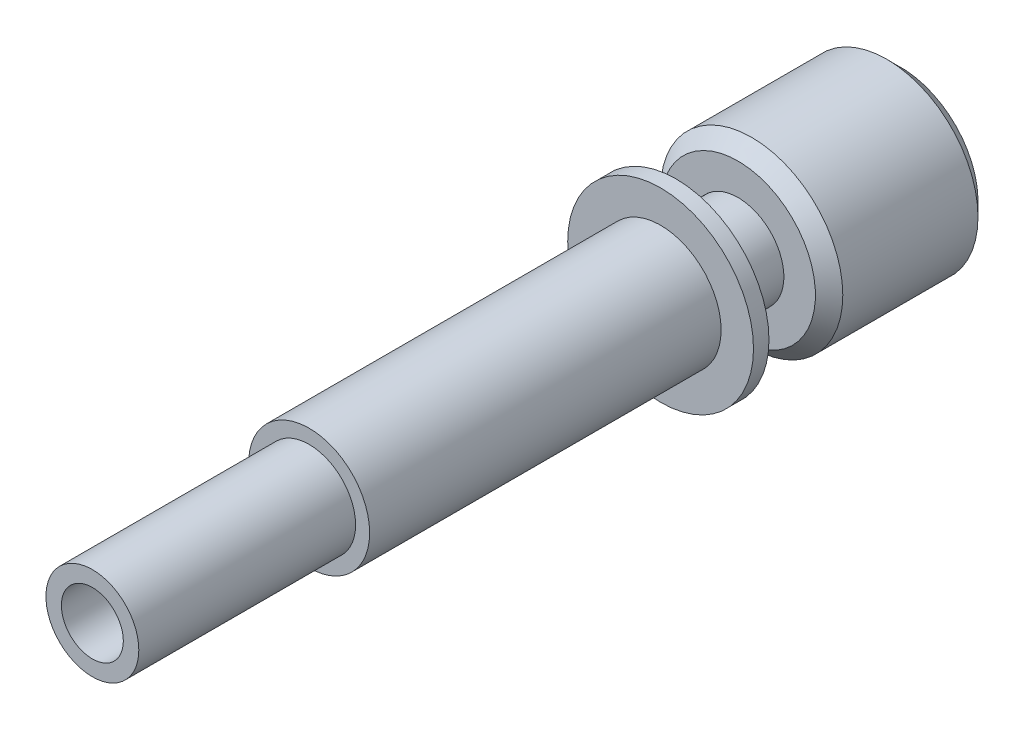
ISO-10303-21;
HEADER;
FILE_DESCRIPTION(('STEP AP214'),'2;1');
FILE_NAME('part.step','',(''),(''),'','','');
FILE_SCHEMA(('AUTOMOTIVE_DESIGN { 1 0 10303 214 1 1 1 1 }'));
ENDSEC;
DATA;
#1=APPLICATION_CONTEXT('core data for automotive mechanical design processes');
#2=APPLICATION_PROTOCOL_DEFINITION('international standard','automotive_design',2000,#1);
#3=PRODUCT_CONTEXT('',#1,'mechanical');
#4=PRODUCT('Part','Part','',(#3));
#5=PRODUCT_RELATED_PRODUCT_CATEGORY('part','',(#4));
#6=PRODUCT_DEFINITION_FORMATION('','',#4);
#7=PRODUCT_DEFINITION_CONTEXT('part definition',#1,'design');
#8=PRODUCT_DEFINITION('design','',#6,#7);
#9=PRODUCT_DEFINITION_SHAPE('','',#8);
#10=(LENGTH_UNIT() NAMED_UNIT(*) SI_UNIT(.MILLI.,.METRE.));
#11=(NAMED_UNIT(*) PLANE_ANGLE_UNIT() SI_UNIT($,.RADIAN.));
#12=(NAMED_UNIT(*) SI_UNIT($,.STERADIAN.) SOLID_ANGLE_UNIT());
#13=UNCERTAINTY_MEASURE_WITH_UNIT(LENGTH_MEASURE(1.E-05),#10,'distance_accuracy_value','');
#14=(GEOMETRIC_REPRESENTATION_CONTEXT(3) GLOBAL_UNCERTAINTY_ASSIGNED_CONTEXT((#13)) GLOBAL_UNIT_ASSIGNED_CONTEXT((#10,
#11,#12)) REPRESENTATION_CONTEXT('',''));
#15=CARTESIAN_POINT('',(0.,0.,0.));
#16=DIRECTION('',(0.,0.,1.));
#17=DIRECTION('',(1.,0.,0.));
#18=AXIS2_PLACEMENT_3D('',#15,#16,#17);
#19=CARTESIAN_POINT('',(0.,0.,0.));
#20=DIRECTION('',(0.,0.,1.));
#21=DIRECTION('',(1.,0.,0.));
#22=AXIS2_PLACEMENT_3D('',#19,#20,#21);
#23=PLANE('',#22);
#24=CARTESIAN_POINT('',(0.,0.,0.));
#25=DIRECTION('',(0.,0.,-1.));
#26=DIRECTION('',(-1.,0.,0.));
#27=AXIS2_PLACEMENT_3D('',#24,#25,#26);
#28=CIRCLE('',#27,1.48);
#29=CARTESIAN_POINT('',(-1.48,0.,0.));
#30=VERTEX_POINT('',#29);
#31=EDGE_CURVE('E18',#30,#30,#28,.T.);
#32=ORIENTED_EDGE('',*,*,#31,.F.);
#33=EDGE_LOOP('',(#32));
#34=FACE_BOUND('',#33,.T.);
#35=CARTESIAN_POINT('',(0.,0.,0.));
#36=DIRECTION('',(0.,0.,1.));
#37=DIRECTION('',(1.,0.,0.));
#38=AXIS2_PLACEMENT_3D('',#35,#36,#37);
#39=CIRCLE('',#38,3.);
#40=CARTESIAN_POINT('',(3.,0.,0.));
#41=VERTEX_POINT('',#40);
#42=EDGE_CURVE('E56',#41,#41,#39,.T.);
#43=ORIENTED_EDGE('',*,*,#42,.F.);
#44=EDGE_LOOP('',(#43));
#45=FACE_BOUND('',#44,.T.);
#46=ADVANCED_FACE('F15',(#34,#45),#23,.F.);
#47=CARTESIAN_POINT('',(0.,0.,0.));
#48=DIRECTION('',(0.,0.,-1.));
#49=DIRECTION('',(-1.,0.,0.));
#50=AXIS2_PLACEMENT_3D('',#47,#48,#49);
#51=CYLINDRICAL_SURFACE('',#50,1.48);
#52=ORIENTED_EDGE('',*,*,#31,.T.);
#53=EDGE_LOOP('',(#52));
#54=FACE_BOUND('',#53,.T.);
#55=CARTESIAN_POINT('',(0.,0.,-2.));
#56=DIRECTION('',(0.,0.,-1.));
#57=DIRECTION('',(-1.,0.,0.));
#58=AXIS2_PLACEMENT_3D('',#55,#56,#57);
#59=CIRCLE('',#58,1.48);
#60=CARTESIAN_POINT('',(-1.48,0.,-2.));
#61=VERTEX_POINT('',#60);
#62=EDGE_CURVE('E54',#61,#61,#59,.F.);
#63=ORIENTED_EDGE('',*,*,#62,.T.);
#64=EDGE_LOOP('',(#63));
#65=FACE_BOUND('',#64,.T.);
#66=ADVANCED_FACE('F63',(#54,#65),#51,.T.);
#67=CARTESIAN_POINT('',(0.,0.,0.));
#68=DIRECTION('',(0.,0.,1.));
#69=DIRECTION('',(1.,0.,0.));
#70=AXIS2_PLACEMENT_3D('',#67,#68,#69);
#71=CYLINDRICAL_SURFACE('',#70,3.);
#72=ORIENTED_EDGE('',*,*,#42,.T.);
#73=EDGE_LOOP('',(#72));
#74=FACE_BOUND('',#73,.T.);
#75=CARTESIAN_POINT('',(0.,0.,0.5));
#76=DIRECTION('',(0.,0.,1.));
#77=DIRECTION('',(1.,0.,0.));
#78=AXIS2_PLACEMENT_3D('',#75,#76,#77);
#79=CIRCLE('',#78,3.);
#80=CARTESIAN_POINT('',(3.,0.,0.5));
#81=VERTEX_POINT('',#80);
#82=EDGE_CURVE('E51',#81,#81,#79,.T.);
#83=ORIENTED_EDGE('',*,*,#82,.F.);
#84=EDGE_LOOP('',(#83));
#85=FACE_BOUND('',#84,.T.);
#86=ADVANCED_FACE('F72',(#74,#85),#71,.T.);
#87=CARTESIAN_POINT('',(0.,0.,-2.));
#88=DIRECTION('',(0.,0.,-1.));
#89=DIRECTION('',(-1.,0.,0.));
#90=AXIS2_PLACEMENT_3D('',#87,#88,#89);
#91=PLANE('',#90);
#92=ORIENTED_EDGE('',*,*,#62,.F.);
#93=EDGE_LOOP('',(#92));
#94=FACE_BOUND('',#93,.T.);
#95=CARTESIAN_POINT('',(0.,0.,-1.99999999995271));
#96=DIRECTION('',(0.,0.,-1.));
#97=DIRECTION('',(-1.,0.,0.));
#98=AXIS2_PLACEMENT_3D('',#95,#96,#97);
#99=CIRCLE('',#98,2.49999999994088);
#100=CARTESIAN_POINT('',(-2.49999999994088,0.,-1.99999999995271));
#101=VERTEX_POINT('',#100);
#102=EDGE_CURVE('E48',#101,#101,#99,.T.);
#103=ORIENTED_EDGE('',*,*,#102,.F.);
#104=EDGE_LOOP('',(#103));
#105=FACE_BOUND('',#104,.T.);
#106=ADVANCED_FACE('F116',(#94,#105),#91,.F.);
#107=CARTESIAN_POINT('',(0.,0.,0.5));
#108=DIRECTION('',(0.,0.,1.));
#109=DIRECTION('',(1.,0.,0.));
#110=AXIS2_PLACEMENT_3D('',#107,#108,#109);
#111=PLANE('',#110);
#112=CARTESIAN_POINT('',(0.,0.,0.5));
#113=DIRECTION('',(0.,0.,1.));
#114=DIRECTION('',(1.,0.,0.));
#115=AXIS2_PLACEMENT_3D('',#112,#113,#114);
#116=CIRCLE('',#115,1.954);
#117=CARTESIAN_POINT('',(1.954,0.,0.5));
#118=VERTEX_POINT('',#117);
#119=EDGE_CURVE('E45',#118,#118,#116,.T.);
#120=ORIENTED_EDGE('',*,*,#119,.F.);
#121=EDGE_LOOP('',(#120));
#122=FACE_BOUND('',#121,.T.);
#123=ORIENTED_EDGE('',*,*,#82,.T.);
#124=EDGE_LOOP('',(#123));
#125=FACE_BOUND('',#124,.T.);
#126=ADVANCED_FACE('F112',(#122,#125),#111,.T.);
#127=CARTESIAN_POINT('',(0.,0.,-2.44199999997363));
#128=DIRECTION('',(0.,0.,-1.));
#129=DIRECTION('',(-1.,0.,0.));
#130=AXIS2_PLACEMENT_3D('',#127,#128,#129);
#131=CONICAL_SURFACE('',#130,2.94199999996181,0.785398163397448);
#132=CARTESIAN_POINT('',(0.,0.,-2.442));
#133=DIRECTION('',(0.,0.,-1.));
#134=DIRECTION('',(-1.,0.,0.));
#135=AXIS2_PLACEMENT_3D('',#132,#133,#134);
#136=CIRCLE('',#135,2.942);
#137=CARTESIAN_POINT('',(-2.942,0.,-2.442));
#138=VERTEX_POINT('',#137);
#139=EDGE_CURVE('E44',#138,#138,#136,.T.);
#140=ORIENTED_EDGE('',*,*,#139,.F.);
#141=EDGE_LOOP('',(#140));
#142=FACE_BOUND('',#141,.T.);
#143=ORIENTED_EDGE('',*,*,#102,.T.);
#144=EDGE_LOOP('',(#143));
#145=FACE_BOUND('',#144,.T.);
#146=ADVANCED_FACE('F108',(#142,#145),#131,.T.);
#147=CARTESIAN_POINT('',(0.,0.,0.5));
#148=DIRECTION('',(0.,0.,1.));
#149=DIRECTION('',(1.,0.,0.));
#150=AXIS2_PLACEMENT_3D('',#147,#148,#149);
#151=CYLINDRICAL_SURFACE('',#150,1.954);
#152=ORIENTED_EDGE('',*,*,#119,.T.);
#153=EDGE_LOOP('',(#152));
#154=FACE_BOUND('',#153,.T.);
#155=CARTESIAN_POINT('',(0.,0.,11.85));
#156=DIRECTION('',(0.,0.,1.));
#157=DIRECTION('',(1.,0.,0.));
#158=AXIS2_PLACEMENT_3D('',#155,#156,#157);
#159=CIRCLE('',#158,1.954);
#160=CARTESIAN_POINT('',(1.954,0.,11.85));
#161=VERTEX_POINT('',#160);
#162=EDGE_CURVE('E41',#161,#161,#159,.T.);
#163=ORIENTED_EDGE('',*,*,#162,.F.);
#164=EDGE_LOOP('',(#163));
#165=FACE_BOUND('',#164,.T.);
#166=ADVANCED_FACE('F104',(#154,#165),#151,.T.);
#167=CARTESIAN_POINT('',(0.,0.,-2.));
#168=DIRECTION('',(0.,0.,-1.));
#169=DIRECTION('',(-1.,0.,0.));
#170=AXIS2_PLACEMENT_3D('',#167,#168,#169);
#171=CYLINDRICAL_SURFACE('',#170,2.942);
#172=ORIENTED_EDGE('',*,*,#139,.T.);
#173=EDGE_LOOP('',(#172));
#174=FACE_BOUND('',#173,.T.);
#175=CARTESIAN_POINT('',(0.,0.,-6.80800000003501));
#176=DIRECTION('',(0.,0.,1.));
#177=DIRECTION('',(1.,0.,0.));
#178=AXIS2_PLACEMENT_3D('',#175,#176,#177);
#179=CIRCLE('',#178,2.94199999996181);
#180=CARTESIAN_POINT('',(2.94199999996181,0.,-6.80800000003501));
#181=VERTEX_POINT('',#180);
#182=EDGE_CURVE('E30',#181,#181,#179,.F.);
#183=ORIENTED_EDGE('',*,*,#182,.F.);
#184=EDGE_LOOP('',(#183));
#185=FACE_BOUND('',#184,.T.);
#186=ADVANCED_FACE('F100',(#174,#185),#171,.T.);
#187=CARTESIAN_POINT('',(0.,0.,11.85));
#188=DIRECTION('',(0.,0.,1.));
#189=DIRECTION('',(1.,0.,0.));
#190=AXIS2_PLACEMENT_3D('',#187,#188,#189);
#191=PLANE('',#190);
#192=CARTESIAN_POINT('',(0.,0.,11.85));
#193=DIRECTION('',(0.,0.,1.));
#194=DIRECTION('',(1.,0.,0.));
#195=AXIS2_PLACEMENT_3D('',#192,#193,#194);
#196=CIRCLE('',#195,1.5);
#197=CARTESIAN_POINT('',(1.5,0.,11.85));
#198=VERTEX_POINT('',#197);
#199=EDGE_CURVE('E38',#198,#198,#196,.T.);
#200=ORIENTED_EDGE('',*,*,#199,.F.);
#201=EDGE_LOOP('',(#200));
#202=FACE_BOUND('',#201,.T.);
#203=ORIENTED_EDGE('',*,*,#162,.T.);
#204=EDGE_LOOP('',(#203));
#205=FACE_BOUND('',#204,.T.);
#206=ADVANCED_FACE('F96',(#202,#205),#191,.T.);
#207=CARTESIAN_POINT('',(0.,0.,-6.80800000009185));
#208=DIRECTION('',(0.,0.,1.));
#209=DIRECTION('',(0.,-1.,0.));
#210=AXIS2_PLACEMENT_3D('',#207,#208,#209);
#211=CONICAL_SURFACE('',#210,2.94199999990497,0.785398163461751);
#212=ORIENTED_EDGE('',*,*,#182,.T.);
#213=EDGE_LOOP('',(#212));
#214=FACE_BOUND('',#213,.T.);
#215=CARTESIAN_POINT('',(0.,0.,-7.24999999994225));
#216=DIRECTION('',(0.,0.,1.));
#217=DIRECTION('',(0.,-1.,0.));
#218=AXIS2_PLACEMENT_3D('',#215,#216,#217);
#219=CIRCLE('',#218,2.49999999999773);
#220=CARTESIAN_POINT('',(0.,-2.49999999999773,-7.24999999994225));
#221=VERTEX_POINT('',#220);
#222=EDGE_CURVE('E35',#221,#221,#219,.F.);
#223=ORIENTED_EDGE('',*,*,#222,.F.);
#224=EDGE_LOOP('',(#223));
#225=FACE_BOUND('',#224,.T.);
#226=ADVANCED_FACE('F92',(#214,#225),#211,.T.);
#227=CARTESIAN_POINT('',(0.,0.,0.));
#228=DIRECTION('',(0.,0.,1.));
#229=DIRECTION('',(1.,0.,0.));
#230=AXIS2_PLACEMENT_3D('',#227,#228,#229);
#231=CYLINDRICAL_SURFACE('',#230,1.5);
#232=ORIENTED_EDGE('',*,*,#199,.T.);
#233=EDGE_LOOP('',(#232));
#234=FACE_BOUND('',#233,.T.);
#235=CARTESIAN_POINT('',(0.,0.,18.85));
#236=DIRECTION('',(0.,0.,1.));
#237=DIRECTION('',(1.,0.,0.));
#238=AXIS2_PLACEMENT_3D('',#235,#236,#237);
#239=CIRCLE('',#238,1.5);
#240=CARTESIAN_POINT('',(1.5,0.,18.85));
#241=VERTEX_POINT('',#240);
#242=EDGE_CURVE('E27',#241,#241,#239,.T.);
#243=ORIENTED_EDGE('',*,*,#242,.F.);
#244=EDGE_LOOP('',(#243));
#245=FACE_BOUND('',#244,.T.);
#246=ADVANCED_FACE('F88',(#234,#245),#231,.T.);
#247=CARTESIAN_POINT('',(0.,0.,-7.25));
#248=DIRECTION('',(0.,0.,-1.));
#249=DIRECTION('',(-1.,0.,0.));
#250=AXIS2_PLACEMENT_3D('',#247,#248,#249);
#251=PLANE('',#250);
#252=CARTESIAN_POINT('',(0.,0.,-7.25));
#253=DIRECTION('',(0.,0.,1.));
#254=DIRECTION('',(1.,0.,0.));
#255=AXIS2_PLACEMENT_3D('',#252,#253,#254);
#256=CIRCLE('',#255,1.);
#257=CARTESIAN_POINT('',(1.,0.,-7.25));
#258=VERTEX_POINT('',#257);
#259=EDGE_CURVE('E22',#258,#258,#256,.T.);
#260=ORIENTED_EDGE('',*,*,#259,.T.);
#261=EDGE_LOOP('',(#260));
#262=FACE_BOUND('',#261,.T.);
#263=ORIENTED_EDGE('',*,*,#222,.T.);
#264=EDGE_LOOP('',(#263));
#265=FACE_BOUND('',#264,.T.);
#266=ADVANCED_FACE('F81',(#262,#265),#251,.T.);
#267=CARTESIAN_POINT('',(0.,0.,18.85));
#268=DIRECTION('',(0.,0.,1.));
#269=DIRECTION('',(1.,0.,0.));
#270=AXIS2_PLACEMENT_3D('',#267,#268,#269);
#271=PLANE('',#270);
#272=CARTESIAN_POINT('',(0.,0.,18.85));
#273=DIRECTION('',(0.,0.,1.));
#274=DIRECTION('',(1.,0.,0.));
#275=AXIS2_PLACEMENT_3D('',#272,#273,#274);
#276=CIRCLE('',#275,1.);
#277=CARTESIAN_POINT('',(1.,0.,18.85));
#278=VERTEX_POINT('',#277);
#279=EDGE_CURVE('E10',#278,#278,#276,.F.);
#280=ORIENTED_EDGE('',*,*,#279,.T.);
#281=EDGE_LOOP('',(#280));
#282=FACE_BOUND('',#281,.T.);
#283=ORIENTED_EDGE('',*,*,#242,.T.);
#284=EDGE_LOOP('',(#283));
#285=FACE_BOUND('',#284,.T.);
#286=ADVANCED_FACE('F75',(#282,#285),#271,.T.);
#287=CARTESIAN_POINT('',(0.,0.,0.));
#288=DIRECTION('',(0.,0.,1.));
#289=DIRECTION('',(1.,0.,0.));
#290=AXIS2_PLACEMENT_3D('',#287,#288,#289);
#291=CYLINDRICAL_SURFACE('',#290,1.);
#292=ORIENTED_EDGE('',*,*,#259,.F.);
#293=EDGE_LOOP('',(#292));
#294=FACE_BOUND('',#293,.T.);
#295=ORIENTED_EDGE('',*,*,#279,.F.);
#296=EDGE_LOOP('',(#295));
#297=FACE_BOUND('',#296,.T.);
#298=ADVANCED_FACE('F73',(#294,#297),#291,.F.);
#299=CLOSED_SHELL('',(#46,#66,#86,#106,#126,#146,#166,#186,#206,#226,#246,#266,#286,#298));
#300=MANIFOLD_SOLID_BREP('B1',#299);
#301=ADVANCED_BREP_SHAPE_REPRESENTATION('',(#18,#300),#14);
#302=SHAPE_DEFINITION_REPRESENTATION(#9,#301);
ENDSEC;
END-ISO-10303-21;
